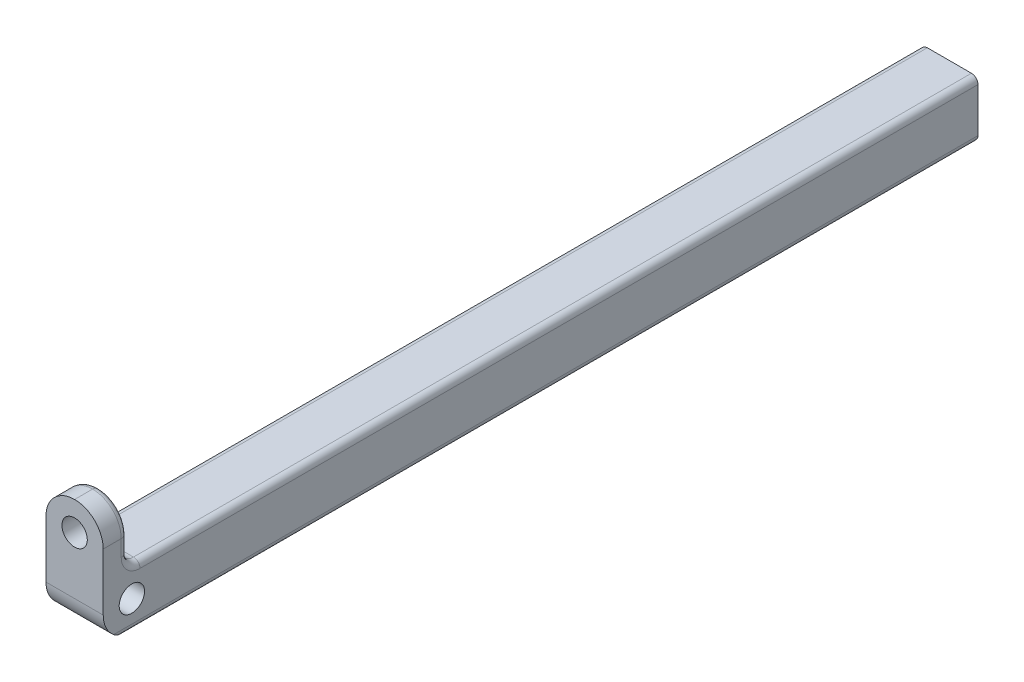
ISO-10303-21;
HEADER;
FILE_DESCRIPTION(('STEP AP214'),'2;1');
FILE_NAME('part.step','',(''),(''),'','','');
FILE_SCHEMA(('AUTOMOTIVE_DESIGN { 1 0 10303 214 1 1 1 1 }'));
ENDSEC;
DATA;
#1=APPLICATION_CONTEXT('core data for automotive mechanical design processes');
#2=APPLICATION_PROTOCOL_DEFINITION('international standard','automotive_design',2000,#1);
#3=PRODUCT_CONTEXT('',#1,'mechanical');
#4=PRODUCT('Part','Part','',(#3));
#5=PRODUCT_RELATED_PRODUCT_CATEGORY('part','',(#4));
#6=PRODUCT_DEFINITION_FORMATION('','',#4);
#7=PRODUCT_DEFINITION_CONTEXT('part definition',#1,'design');
#8=PRODUCT_DEFINITION('design','',#6,#7);
#9=PRODUCT_DEFINITION_SHAPE('','',#8);
#10=(LENGTH_UNIT() NAMED_UNIT(*) SI_UNIT(.MILLI.,.METRE.));
#11=(NAMED_UNIT(*) PLANE_ANGLE_UNIT() SI_UNIT($,.RADIAN.));
#12=(NAMED_UNIT(*) SI_UNIT($,.STERADIAN.) SOLID_ANGLE_UNIT());
#13=UNCERTAINTY_MEASURE_WITH_UNIT(LENGTH_MEASURE(1.E-05),#10,'distance_accuracy_value','');
#14=(GEOMETRIC_REPRESENTATION_CONTEXT(3) GLOBAL_UNCERTAINTY_ASSIGNED_CONTEXT((#13)) GLOBAL_UNIT_ASSIGNED_CONTEXT((#10,
#11,#12)) REPRESENTATION_CONTEXT('',''));
#15=CARTESIAN_POINT('',(0.,0.,0.));
#16=DIRECTION('',(0.,0.,1.));
#17=DIRECTION('',(1.,0.,0.));
#18=AXIS2_PLACEMENT_3D('',#15,#16,#17);
#19=CARTESIAN_POINT('',(-3.5,3.5,107.));
#20=DIRECTION('',(0.,-1.,0.));
#21=DIRECTION('',(0.,0.,-1.));
#22=AXIS2_PLACEMENT_3D('',#19,#20,#21);
#23=PLANE('',#22);
#24=DIRECTION('',(-1.,0.,0.));
#25=VECTOR('',#24,1.);
#26=CARTESIAN_POINT('',(-3.5,3.5,0.));
#27=LINE('',#26,#25);
#28=CARTESIAN_POINT('',(2.7,3.5,0.));
#29=VERTEX_POINT('',#28);
#30=CARTESIAN_POINT('',(-2.7,3.5,0.));
#31=VERTEX_POINT('',#30);
#32=EDGE_CURVE('E182',#29,#31,#27,.T.);
#33=ORIENTED_EDGE('',*,*,#32,.T.);
#34=DIRECTION('',(0.,0.,-1.));
#35=VECTOR('',#34,1.);
#36=CARTESIAN_POINT('',(-2.7,3.5,107.));
#37=LINE('',#36,#35);
#38=CARTESIAN_POINT('',(-2.7,3.5,102.5));
#39=VERTEX_POINT('',#38);
#40=EDGE_CURVE('E222',#31,#39,#37,.F.);
#41=ORIENTED_EDGE('',*,*,#40,.T.);
#42=DIRECTION('',(-1.,0.,0.));
#43=VECTOR('',#42,1.);
#44=CARTESIAN_POINT('',(3.5,3.5,102.5));
#45=LINE('',#44,#43);
#46=CARTESIAN_POINT('',(2.7,3.5,102.5));
#47=VERTEX_POINT('',#46);
#48=EDGE_CURVE('E205',#39,#47,#45,.F.);
#49=ORIENTED_EDGE('',*,*,#48,.T.);
#50=DIRECTION('',(0.,0.,-1.));
#51=VECTOR('',#50,1.);
#52=CARTESIAN_POINT('',(2.7,3.5,107.));
#53=LINE('',#52,#51);
#54=EDGE_CURVE('E220',#47,#29,#53,.T.);
#55=ORIENTED_EDGE('',*,*,#54,.T.);
#56=EDGE_LOOP('',(#33,#41,#49,#55));
#57=FACE_BOUND('',#56,.T.);
#58=ADVANCED_FACE('F37',(#57),#23,.F.);
#59=CARTESIAN_POINT('',(3.5,3.5,107.));
#60=DIRECTION('',(-1.,0.,0.));
#61=DIRECTION('',(0.,-1.,0.));
#62=AXIS2_PLACEMENT_3D('',#59,#60,#61);
#63=PLANE('',#62);
#64=CARTESIAN_POINT('',(3.5,0.,103.5));
#65=DIRECTION('',(1.,0.,0.));
#66=DIRECTION('',(0.,1.,0.));
#67=AXIS2_PLACEMENT_3D('',#64,#65,#66);
#68=CIRCLE('',#67,1.54999999999999);
#69=CARTESIAN_POINT('',(3.5,1.54999999999999,103.5));
#70=VERTEX_POINT('',#69);
#71=EDGE_CURVE('E177',#70,#70,#68,.T.);
#72=ORIENTED_EDGE('',*,*,#71,.F.);
#73=EDGE_LOOP('',(#72));
#74=FACE_BOUND('',#73,.T.);
#75=CARTESIAN_POINT('',(3.5,0.,103.5));
#76=DIRECTION('',(-1.,0.,0.));
#77=DIRECTION('',(0.,-1.,0.));
#78=AXIS2_PLACEMENT_3D('',#75,#76,#77);
#79=CIRCLE('',#78,3.5);
#80=CARTESIAN_POINT('',(3.5,0.,107.));
#81=VERTEX_POINT('',#80);
#82=CARTESIAN_POINT('',(3.5,-2.7,105.727105745132));
#83=VERTEX_POINT('',#82);
#84=EDGE_CURVE('E148',#81,#83,#79,.F.);
#85=ORIENTED_EDGE('',*,*,#84,.T.);
#86=DIRECTION('',(0.,0.,-1.));
#87=VECTOR('',#86,1.);
#88=CARTESIAN_POINT('',(3.5,-2.7,107.));
#89=LINE('',#88,#87);
#90=CARTESIAN_POINT('',(3.5,-2.7,0.));
#91=VERTEX_POINT('',#90);
#92=EDGE_CURVE('E11',#83,#91,#89,.T.);
#93=ORIENTED_EDGE('',*,*,#92,.T.);
#94=DIRECTION('',(0.,1.,0.));
#95=VECTOR('',#94,1.);
#96=CARTESIAN_POINT('',(3.5,3.5,0.));
#97=LINE('',#96,#95);
#98=CARTESIAN_POINT('',(3.5,2.7,0.));
#99=VERTEX_POINT('',#98);
#100=EDGE_CURVE('E180',#91,#99,#97,.T.);
#101=ORIENTED_EDGE('',*,*,#100,.T.);
#102=DIRECTION('',(0.,0.,-1.));
#103=VECTOR('',#102,1.);
#104=CARTESIAN_POINT('',(3.5,2.7,107.));
#105=LINE('',#104,#103);
#106=CARTESIAN_POINT('',(3.5,2.7,102.5));
#107=VERTEX_POINT('',#106);
#108=EDGE_CURVE('E240',#99,#107,#105,.F.);
#109=ORIENTED_EDGE('',*,*,#108,.T.);
#110=CARTESIAN_POINT('',(3.5,5.,102.5));
#111=DIRECTION('',(-1.,0.,0.));
#112=DIRECTION('',(0.,-1.,0.));
#113=AXIS2_PLACEMENT_3D('',#110,#111,#112);
#114=CIRCLE('',#113,2.3);
#115=CARTESIAN_POINT('',(3.5,5.,104.8));
#116=VERTEX_POINT('',#115);
#117=EDGE_CURVE('E242',#107,#116,#114,.T.);
#118=ORIENTED_EDGE('',*,*,#117,.T.);
#119=DIRECTION('',(0.,-1.,0.));
#120=VECTOR('',#119,1.);
#121=CARTESIAN_POINT('',(3.5,3.5,104.8));
#122=LINE('',#121,#120);
#123=CARTESIAN_POINT('',(3.5,7.,104.8));
#124=VERTEX_POINT('',#123);
#125=EDGE_CURVE('E244',#116,#124,#122,.F.);
#126=ORIENTED_EDGE('',*,*,#125,.T.);
#127=DIRECTION('',(0.,0.,-1.));
#128=VECTOR('',#127,1.);
#129=CARTESIAN_POINT('',(3.5,7.,107.));
#130=LINE('',#129,#128);
#131=CARTESIAN_POINT('',(3.5,7.,107.));
#132=VERTEX_POINT('',#131);
#133=EDGE_CURVE('E168',#124,#132,#130,.F.);
#134=ORIENTED_EDGE('',*,*,#133,.T.);
#135=DIRECTION('',(0.,1.,0.));
#136=VECTOR('',#135,1.);
#137=CARTESIAN_POINT('',(3.5,3.5,107.));
#138=LINE('',#137,#136);
#139=EDGE_CURVE('E162',#81,#132,#138,.T.);
#140=ORIENTED_EDGE('',*,*,#139,.F.);
#141=EDGE_LOOP('',(#85,#93,#101,#109,#118,#126,#134,#140));
#142=FACE_BOUND('',#141,.T.);
#143=ADVANCED_FACE('F166',(#74,#142),#63,.F.);
#144=CARTESIAN_POINT('',(-3.5,3.5,107.));
#145=DIRECTION('',(1.,0.,0.));
#146=DIRECTION('',(0.,1.,0.));
#147=AXIS2_PLACEMENT_3D('',#144,#145,#146);
#148=PLANE('',#147);
#149=CARTESIAN_POINT('',(-3.5,0.,103.5));
#150=DIRECTION('',(1.,0.,0.));
#151=DIRECTION('',(0.,1.,0.));
#152=AXIS2_PLACEMENT_3D('',#149,#150,#151);
#153=CIRCLE('',#152,1.54999999999999);
#154=CARTESIAN_POINT('',(-3.5,1.54999999999999,103.5));
#155=VERTEX_POINT('',#154);
#156=EDGE_CURVE('E183',#155,#155,#153,.T.);
#157=ORIENTED_EDGE('',*,*,#156,.T.);
#158=EDGE_LOOP('',(#157));
#159=FACE_BOUND('',#158,.T.);
#160=DIRECTION('',(0.,-1.,0.));
#161=VECTOR('',#160,1.);
#162=CARTESIAN_POINT('',(-3.5,3.5,0.));
#163=LINE('',#162,#161);
#164=CARTESIAN_POINT('',(-3.5,2.7,0.));
#165=VERTEX_POINT('',#164);
#166=CARTESIAN_POINT('',(-3.5,-2.7,0.));
#167=VERTEX_POINT('',#166);
#168=EDGE_CURVE('E174',#165,#167,#163,.T.);
#169=ORIENTED_EDGE('',*,*,#168,.T.);
#170=DIRECTION('',(0.,0.,-1.));
#171=VECTOR('',#170,1.);
#172=CARTESIAN_POINT('',(-3.5,-2.7,107.));
#173=LINE('',#172,#171);
#174=CARTESIAN_POINT('',(-3.5,-2.7,105.727105745132));
#175=VERTEX_POINT('',#174);
#176=EDGE_CURVE('E61',#167,#175,#173,.F.);
#177=ORIENTED_EDGE('',*,*,#176,.T.);
#178=CARTESIAN_POINT('',(-3.5,0.,103.5));
#179=DIRECTION('',(1.,0.,0.));
#180=DIRECTION('',(0.,1.,0.));
#181=AXIS2_PLACEMENT_3D('',#178,#179,#180);
#182=CIRCLE('',#181,3.5);
#183=CARTESIAN_POINT('',(-3.5,0.,107.));
#184=VERTEX_POINT('',#183);
#185=EDGE_CURVE('E189',#175,#184,#182,.F.);
#186=ORIENTED_EDGE('',*,*,#185,.T.);
#187=DIRECTION('',(0.,-1.,0.));
#188=VECTOR('',#187,1.);
#189=CARTESIAN_POINT('',(-3.5,3.5,107.));
#190=LINE('',#189,#188);
#191=CARTESIAN_POINT('',(-3.5,7.,107.));
#192=VERTEX_POINT('',#191);
#193=EDGE_CURVE('E164',#192,#184,#190,.T.);
#194=ORIENTED_EDGE('',*,*,#193,.F.);
#195=DIRECTION('',(0.,0.,1.));
#196=VECTOR('',#195,1.);
#197=CARTESIAN_POINT('',(-3.5,7.,107.));
#198=LINE('',#197,#196);
#199=CARTESIAN_POINT('',(-3.5,7.,104.8));
#200=VERTEX_POINT('',#199);
#201=EDGE_CURVE('E196',#192,#200,#198,.F.);
#202=ORIENTED_EDGE('',*,*,#201,.T.);
#203=DIRECTION('',(0.,-1.,0.));
#204=VECTOR('',#203,1.);
#205=CARTESIAN_POINT('',(-3.5,3.5,104.8));
#206=LINE('',#205,#204);
#207=CARTESIAN_POINT('',(-3.5,5.,104.8));
#208=VERTEX_POINT('',#207);
#209=EDGE_CURVE('E208',#200,#208,#206,.T.);
#210=ORIENTED_EDGE('',*,*,#209,.T.);
#211=CARTESIAN_POINT('',(-3.5,5.,102.5));
#212=DIRECTION('',(1.,0.,0.));
#213=DIRECTION('',(0.,1.,0.));
#214=AXIS2_PLACEMENT_3D('',#211,#212,#213);
#215=CIRCLE('',#214,2.3);
#216=CARTESIAN_POINT('',(-3.5,2.7,102.5));
#217=VERTEX_POINT('',#216);
#218=EDGE_CURVE('E210',#208,#217,#215,.T.);
#219=ORIENTED_EDGE('',*,*,#218,.T.);
#220=DIRECTION('',(0.,0.,-1.));
#221=VECTOR('',#220,1.);
#222=CARTESIAN_POINT('',(-3.5,2.7,107.));
#223=LINE('',#222,#221);
#224=EDGE_CURVE('E212',#217,#165,#223,.T.);
#225=ORIENTED_EDGE('',*,*,#224,.T.);
#226=EDGE_LOOP('',(#169,#177,#186,#194,#202,#210,#219,#225));
#227=FACE_BOUND('',#226,.T.);
#228=ADVANCED_FACE('F354',(#159,#227),#148,.F.);
#229=CARTESIAN_POINT('',(-3.5,-3.5,107.));
#230=DIRECTION('',(0.,1.,0.));
#231=DIRECTION('',(0.,0.,1.));
#232=AXIS2_PLACEMENT_3D('',#229,#230,#231);
#233=PLANE('',#232);
#234=DIRECTION('',(1.,0.,0.));
#235=VECTOR('',#234,1.);
#236=CARTESIAN_POINT('',(-3.5,-3.5,103.5));
#237=LINE('',#236,#235);
#238=CARTESIAN_POINT('',(2.7,-3.5,103.5));
#239=VERTEX_POINT('',#238);
#240=CARTESIAN_POINT('',(-2.7,-3.5,103.5));
#241=VERTEX_POINT('',#240);
#242=EDGE_CURVE('E155',#239,#241,#237,.F.);
#243=ORIENTED_EDGE('',*,*,#242,.T.);
#244=DIRECTION('',(0.,0.,-1.));
#245=VECTOR('',#244,1.);
#246=CARTESIAN_POINT('',(-2.7,-3.5,107.));
#247=LINE('',#246,#245);
#248=CARTESIAN_POINT('',(-2.7,-3.5,0.));
#249=VERTEX_POINT('',#248);
#250=EDGE_CURVE('E270',#241,#249,#247,.T.);
#251=ORIENTED_EDGE('',*,*,#250,.T.);
#252=DIRECTION('',(1.,0.,0.));
#253=VECTOR('',#252,1.);
#254=CARTESIAN_POINT('',(-3.5,-3.5,0.));
#255=LINE('',#254,#253);
#256=CARTESIAN_POINT('',(2.7,-3.5,0.));
#257=VERTEX_POINT('',#256);
#258=EDGE_CURVE('E170',#249,#257,#255,.T.);
#259=ORIENTED_EDGE('',*,*,#258,.T.);
#260=DIRECTION('',(0.,0.,-1.));
#261=VECTOR('',#260,1.);
#262=CARTESIAN_POINT('',(2.7,-3.5,107.));
#263=LINE('',#262,#261);
#264=EDGE_CURVE('E246',#257,#239,#263,.F.);
#265=ORIENTED_EDGE('',*,*,#264,.T.);
#266=EDGE_LOOP('',(#243,#251,#259,#265));
#267=FACE_BOUND('',#266,.T.);
#268=ADVANCED_FACE('F359',(#267),#233,.F.);
#269=CARTESIAN_POINT('',(0.,0.,107.));
#270=DIRECTION('',(0.,0.,1.));
#271=DIRECTION('',(1.,0.,0.));
#272=AXIS2_PLACEMENT_3D('',#269,#270,#271);
#273=PLANE('',#272);
#274=CARTESIAN_POINT('',(0.,7.,107.));
#275=DIRECTION('',(0.,0.,-1.));
#276=DIRECTION('',(-1.,0.,0.));
#277=AXIS2_PLACEMENT_3D('',#274,#275,#276);
#278=CIRCLE('',#277,1.55);
#279=CARTESIAN_POINT('',(-1.55,7.,107.));
#280=VERTEX_POINT('',#279);
#281=EDGE_CURVE('E202',#280,#280,#278,.T.);
#282=ORIENTED_EDGE('',*,*,#281,.T.);
#283=EDGE_LOOP('',(#282));
#284=FACE_BOUND('',#283,.T.);
#285=ORIENTED_EDGE('',*,*,#139,.T.);
#286=CARTESIAN_POINT('',(0.,7.,107.));
#287=DIRECTION('',(0.,0.,1.));
#288=DIRECTION('',(1.,0.,0.));
#289=AXIS2_PLACEMENT_3D('',#286,#287,#288);
#290=CIRCLE('',#289,3.5);
#291=CARTESIAN_POINT('',(0.,10.5,107.));
#292=VERTEX_POINT('',#291);
#293=EDGE_CURVE('E194',#132,#292,#290,.T.);
#294=ORIENTED_EDGE('',*,*,#293,.T.);
#295=CARTESIAN_POINT('',(0.,7.,107.));
#296=DIRECTION('',(0.,0.,1.));
#297=DIRECTION('',(1.,0.,0.));
#298=AXIS2_PLACEMENT_3D('',#295,#296,#297);
#299=CIRCLE('',#298,3.5);
#300=EDGE_CURVE('E192',#292,#192,#299,.T.);
#301=ORIENTED_EDGE('',*,*,#300,.T.);
#302=ORIENTED_EDGE('',*,*,#193,.T.);
#303=DIRECTION('',(1.,0.,0.));
#304=VECTOR('',#303,1.);
#305=CARTESIAN_POINT('',(3.5,0.,107.));
#306=LINE('',#305,#304);
#307=EDGE_CURVE('E151',#184,#81,#306,.T.);
#308=ORIENTED_EDGE('',*,*,#307,.T.);
#309=EDGE_LOOP('',(#285,#294,#301,#302,#308));
#310=FACE_BOUND('',#309,.T.);
#311=ADVANCED_FACE('F160',(#284,#310),#273,.T.);
#312=CARTESIAN_POINT('',(0.,0.,0.));
#313=DIRECTION('',(0.,0.,1.));
#314=DIRECTION('',(1.,0.,0.));
#315=AXIS2_PLACEMENT_3D('',#312,#313,#314);
#316=PLANE('',#315);
#317=ORIENTED_EDGE('',*,*,#258,.F.);
#318=CARTESIAN_POINT('',(-2.7,-2.7,0.));
#319=DIRECTION('',(0.,0.,1.));
#320=DIRECTION('',(1.,0.,0.));
#321=AXIS2_PLACEMENT_3D('',#318,#319,#320);
#322=CIRCLE('',#321,0.8);
#323=EDGE_CURVE('E275',#249,#167,#322,.F.);
#324=ORIENTED_EDGE('',*,*,#323,.T.);
#325=ORIENTED_EDGE('',*,*,#168,.F.);
#326=CARTESIAN_POINT('',(-2.7,2.7,0.));
#327=DIRECTION('',(0.,0.,1.));
#328=DIRECTION('',(1.,0.,0.));
#329=AXIS2_PLACEMENT_3D('',#326,#327,#328);
#330=CIRCLE('',#329,0.8);
#331=EDGE_CURVE('E218',#165,#31,#330,.F.);
#332=ORIENTED_EDGE('',*,*,#331,.T.);
#333=ORIENTED_EDGE('',*,*,#32,.F.);
#334=CARTESIAN_POINT('',(2.7,2.7,0.));
#335=DIRECTION('',(0.,0.,1.));
#336=DIRECTION('',(1.,0.,0.));
#337=AXIS2_PLACEMENT_3D('',#334,#335,#336);
#338=CIRCLE('',#337,0.8);
#339=EDGE_CURVE('E215',#29,#99,#338,.F.);
#340=ORIENTED_EDGE('',*,*,#339,.T.);
#341=ORIENTED_EDGE('',*,*,#100,.F.);
#342=CARTESIAN_POINT('',(2.7,-2.7,0.));
#343=DIRECTION('',(0.,0.,1.));
#344=DIRECTION('',(1.,0.,0.));
#345=AXIS2_PLACEMENT_3D('',#342,#343,#344);
#346=CIRCLE('',#345,0.8);
#347=EDGE_CURVE('E273',#91,#257,#346,.F.);
#348=ORIENTED_EDGE('',*,*,#347,.T.);
#349=EDGE_LOOP('',(#317,#324,#325,#332,#333,#340,#341,#348));
#350=FACE_BOUND('',#349,.T.);
#351=ADVANCED_FACE('F290',(#350),#316,.F.);
#352=CARTESIAN_POINT('',(0.,0.,103.5));
#353=DIRECTION('',(-1.,0.,0.));
#354=DIRECTION('',(0.,0.,1.));
#355=AXIS2_PLACEMENT_3D('',#352,#353,#354);
#356=CYLINDRICAL_SURFACE('',#355,3.5);
#357=ORIENTED_EDGE('',*,*,#185,.F.);
#358=CARTESIAN_POINT('',(-3.5,-2.7,105.727105745132));
#359=CARTESIAN_POINT('',(-3.49997790634017,-2.73578077826927,105.683740012094));
#360=CARTESIAN_POINT('',(-3.49760204742852,-2.77046771405746,105.639546970417));
#361=CARTESIAN_POINT('',(-3.48883215337653,-2.83744212990076,105.549885837599));
#362=CARTESIAN_POINT('',(-3.48244581441398,-2.86973407357622,105.504420347611));
#363=CARTESIAN_POINT('',(-3.46639989402995,-2.9316099904447,105.412773436482));
#364=CARTESIAN_POINT('',(-3.45676542280018,-2.96121258994889,105.366600026079));
#365=CARTESIAN_POINT('',(-3.43472922580525,-3.01796243965984,105.273381562708));
#366=CARTESIAN_POINT('',(-3.42232567892856,-3.04510805741891,105.226335954888));
#367=CARTESIAN_POINT('',(-3.38721924491046,-3.1121771529453,105.103656190191));
#368=CARTESIAN_POINT('',(-3.36275094354892,-3.15021900189438,105.027491078594));
#369=CARTESIAN_POINT('',(-3.30939609632481,-3.22016334972214,104.873927316086));
#370=CARTESIAN_POINT('',(-3.28050786925723,-3.25206350201542,104.796528205876));
#371=CARTESIAN_POINT('',(-3.18861879254974,-3.3390615021577,104.56230135668));
#372=CARTESIAN_POINT('',(-3.12057510030014,-3.38514640407985,104.404021503058));
#373=CARTESIAN_POINT('',(-2.99437521495339,-3.4463534981345,104.123081332067));
#374=CARTESIAN_POINT('',(-2.93762159241726,-3.466193436758,104.000736087576));
#375=CARTESIAN_POINT('',(-2.82227073924932,-3.4928054574686,103.755791889969));
#376=CARTESIAN_POINT('',(-2.76367847793431,-3.49961011925023,103.633194338056));
#377=CARTESIAN_POINT('',(-2.70340235184538,-3.4999945715011,103.507116536324));
#378=CARTESIAN_POINT('',(-2.70170115627901,-3.49999999744037,103.50355823084));
#379=CARTESIAN_POINT('',(-2.7,-3.5,103.5));
#380=B_SPLINE_CURVE_WITH_KNOTS('',3,(#358,#359,#360,#361,#362,#363,#364,#365,#366,#367,#368,
#369,#370,#371,#372,#373,#374,#375,#376,#377,#378,#379),.UNSPECIFIED.,.F.,.F.,(4,2,2,2,2,2,2,2,
2,2,4),(0.,0.168516062198225,0.336709723374923,0.503631866603884,0.670664113019234,
0.935994806454121,1.20142667565851,1.73430812786229,2.14272752893249,2.55012480907741,
2.56195697984311),.UNSPECIFIED.);
#381=EDGE_CURVE('E46',#175,#241,#380,.T.);
#382=ORIENTED_EDGE('',*,*,#381,.T.);
#383=ORIENTED_EDGE('',*,*,#242,.F.);
#384=CARTESIAN_POINT('',(3.5,-2.7,105.727105745132));
#385=CARTESIAN_POINT('',(3.49997790634017,-2.73578077826927,105.683740012094));
#386=CARTESIAN_POINT('',(3.49760204742852,-2.77046771405747,105.639546970416));
#387=CARTESIAN_POINT('',(3.48883215337653,-2.83744212990077,105.549885837599));
#388=CARTESIAN_POINT('',(3.48244581441398,-2.86973407357623,105.504420347611));
#389=CARTESIAN_POINT('',(3.46639989402994,-2.93160999044472,105.412773436482));
#390=CARTESIAN_POINT('',(3.45676542280018,-2.9612125899489,105.366600026079));
#391=CARTESIAN_POINT('',(3.43472922580525,-3.01796243965984,105.273381562708));
#392=CARTESIAN_POINT('',(3.42232567892856,-3.04510805741891,105.226335954888));
#393=CARTESIAN_POINT('',(3.38721924491046,-3.1121771529453,105.103656190191));
#394=CARTESIAN_POINT('',(3.36275094354893,-3.15021900189437,105.027491078594));
#395=CARTESIAN_POINT('',(3.30939609632482,-3.22016334972213,104.873927316086));
#396=CARTESIAN_POINT('',(3.28050786925723,-3.25206350201541,104.796528205876));
#397=CARTESIAN_POINT('',(3.18861879254976,-3.3390615021577,104.56230135668));
#398=CARTESIAN_POINT('',(3.12057510030023,-3.38514640407985,104.404021503058));
#399=CARTESIAN_POINT('',(2.99437521495333,-3.4463534981345,104.123081332067));
#400=CARTESIAN_POINT('',(2.93762159241704,-3.466193436758,104.000736087576));
#401=CARTESIAN_POINT('',(2.82227073924954,-3.4928054574686,103.755791889969));
#402=CARTESIAN_POINT('',(2.76367847793513,-3.49961011925023,103.633194338056));
#403=CARTESIAN_POINT('',(2.70340235184543,-3.4999945715011,103.507116536324));
#404=CARTESIAN_POINT('',(2.70170115627903,-3.49999999744037,103.50355823084));
#405=CARTESIAN_POINT('',(2.7,-3.5,103.5));
#406=B_SPLINE_CURVE_WITH_KNOTS('',3,(#384,#385,#386,#387,#388,#389,#390,#391,#392,#393,#394,
#395,#396,#397,#398,#399,#400,#401,#402,#403,#404,#405),.UNSPECIFIED.,.F.,.F.,(4,2,2,2,2,2,2,2,
2,2,4),(0.,0.168516062198242,0.336709723374957,0.5036318666039,0.670664113019234,
0.935994806454103,1.20142667565847,1.73430812786229,2.14272752893249,2.55012480907741,
2.56195697984311),.UNSPECIFIED.);
#407=EDGE_CURVE('E53',#239,#83,#406,.F.);
#408=ORIENTED_EDGE('',*,*,#407,.T.);
#409=ORIENTED_EDGE('',*,*,#84,.F.);
#410=ORIENTED_EDGE('',*,*,#307,.F.);
#411=EDGE_LOOP('',(#357,#382,#383,#408,#409,#410));
#412=FACE_BOUND('',#411,.T.);
#413=ADVANCED_FACE('F150',(#412),#356,.T.);
#414=CARTESIAN_POINT('',(-3.5,0.,103.5));
#415=DIRECTION('',(1.,0.,0.));
#416=DIRECTION('',(0.,1.,0.));
#417=AXIS2_PLACEMENT_3D('',#414,#415,#416);
#418=CYLINDRICAL_SURFACE('',#417,1.54999999999999);
#419=ORIENTED_EDGE('',*,*,#156,.F.);
#420=EDGE_LOOP('',(#419));
#421=FACE_BOUND('',#420,.T.);
#422=ORIENTED_EDGE('',*,*,#71,.T.);
#423=EDGE_LOOP('',(#422));
#424=FACE_BOUND('',#423,.T.);
#425=ADVANCED_FACE('F289',(#421,#424),#418,.F.);
#426=CARTESIAN_POINT('',(-3.5,10.5,104.));
#427=DIRECTION('',(0.,0.,1.));
#428=DIRECTION('',(1.,0.,0.));
#429=AXIS2_PLACEMENT_3D('',#426,#427,#428);
#430=PLANE('',#429);
#431=CARTESIAN_POINT('',(0.,7.,104.));
#432=DIRECTION('',(0.,0.,-1.));
#433=DIRECTION('',(-1.,0.,0.));
#434=AXIS2_PLACEMENT_3D('',#431,#432,#433);
#435=CIRCLE('',#434,1.55);
#436=CARTESIAN_POINT('',(-1.55,7.,104.));
#437=VERTEX_POINT('',#436);
#438=EDGE_CURVE('E268',#437,#437,#435,.T.);
#439=ORIENTED_EDGE('',*,*,#438,.F.);
#440=EDGE_LOOP('',(#439));
#441=FACE_BOUND('',#440,.T.);
#442=DIRECTION('',(-1.,0.,0.));
#443=VECTOR('',#442,1.);
#444=CARTESIAN_POINT('',(-3.5,5.,104.));
#445=LINE('',#444,#443);
#446=CARTESIAN_POINT('',(2.7,5.,104.));
#447=VERTEX_POINT('',#446);
#448=CARTESIAN_POINT('',(-2.7,5.,104.));
#449=VERTEX_POINT('',#448);
#450=EDGE_CURVE('E199',#447,#449,#445,.T.);
#451=ORIENTED_EDGE('',*,*,#450,.T.);
#452=DIRECTION('',(0.,-1.,0.));
#453=VECTOR('',#452,1.);
#454=CARTESIAN_POINT('',(-2.7,10.5,104.));
#455=LINE('',#454,#453);
#456=CARTESIAN_POINT('',(-2.7,7.,104.));
#457=VERTEX_POINT('',#456);
#458=EDGE_CURVE('E234',#449,#457,#455,.F.);
#459=ORIENTED_EDGE('',*,*,#458,.T.);
#460=CARTESIAN_POINT('',(0.,7.,104.));
#461=DIRECTION('',(0.,0.,1.));
#462=DIRECTION('',(1.,0.,0.));
#463=AXIS2_PLACEMENT_3D('',#460,#461,#462);
#464=CIRCLE('',#463,2.7);
#465=CARTESIAN_POINT('',(0.,9.7,104.));
#466=VERTEX_POINT('',#465);
#467=EDGE_CURVE('E232',#457,#466,#464,.F.);
#468=ORIENTED_EDGE('',*,*,#467,.T.);
#469=CARTESIAN_POINT('',(0.,7.,104.));
#470=DIRECTION('',(0.,0.,1.));
#471=DIRECTION('',(1.,0.,0.));
#472=AXIS2_PLACEMENT_3D('',#469,#470,#471);
#473=CIRCLE('',#472,2.7);
#474=CARTESIAN_POINT('',(2.7,7.,104.));
#475=VERTEX_POINT('',#474);
#476=EDGE_CURVE('E230',#466,#475,#473,.F.);
#477=ORIENTED_EDGE('',*,*,#476,.T.);
#478=DIRECTION('',(0.,-1.,0.));
#479=VECTOR('',#478,1.);
#480=CARTESIAN_POINT('',(2.7,10.5,104.));
#481=LINE('',#480,#479);
#482=EDGE_CURVE('E228',#475,#447,#481,.T.);
#483=ORIENTED_EDGE('',*,*,#482,.T.);
#484=EDGE_LOOP('',(#451,#459,#468,#477,#483));
#485=FACE_BOUND('',#484,.T.);
#486=ADVANCED_FACE('F301',(#441,#485),#430,.F.);
#487=CARTESIAN_POINT('',(0.,7.,0.));
#488=DIRECTION('',(0.,0.,1.));
#489=DIRECTION('',(1.,0.,0.));
#490=AXIS2_PLACEMENT_3D('',#487,#488,#489);
#491=CYLINDRICAL_SURFACE('',#490,3.5);
#492=DIRECTION('',(0.,0.,1.));
#493=VECTOR('',#492,1.);
#494=CARTESIAN_POINT('',(0.,10.5,0.));
#495=LINE('',#494,#493);
#496=CARTESIAN_POINT('',(0.,10.5,104.8));
#497=VERTEX_POINT('',#496);
#498=EDGE_CURVE('E200',#497,#292,#495,.T.);
#499=ORIENTED_EDGE('',*,*,#498,.F.);
#500=CARTESIAN_POINT('',(0.,7.,104.8));
#501=DIRECTION('',(0.,0.,1.));
#502=DIRECTION('',(1.,0.,0.));
#503=AXIS2_PLACEMENT_3D('',#500,#501,#502);
#504=CIRCLE('',#503,3.5);
#505=EDGE_CURVE('E236',#497,#200,#504,.T.);
#506=ORIENTED_EDGE('',*,*,#505,.T.);
#507=ORIENTED_EDGE('',*,*,#201,.F.);
#508=ORIENTED_EDGE('',*,*,#300,.F.);
#509=EDGE_LOOP('',(#499,#506,#507,#508));
#510=FACE_BOUND('',#509,.T.);
#511=ADVANCED_FACE('F297',(#510),#491,.T.);
#512=CARTESIAN_POINT('',(0.,7.,0.));
#513=DIRECTION('',(0.,0.,-1.));
#514=DIRECTION('',(-1.,0.,0.));
#515=AXIS2_PLACEMENT_3D('',#512,#513,#514);
#516=CYLINDRICAL_SURFACE('',#515,3.5);
#517=ORIENTED_EDGE('',*,*,#133,.F.);
#518=CARTESIAN_POINT('',(0.,7.,104.8));
#519=DIRECTION('',(0.,0.,1.));
#520=DIRECTION('',(1.,0.,0.));
#521=AXIS2_PLACEMENT_3D('',#518,#519,#520);
#522=CIRCLE('',#521,3.5);
#523=EDGE_CURVE('E238',#124,#497,#522,.T.);
#524=ORIENTED_EDGE('',*,*,#523,.T.);
#525=ORIENTED_EDGE('',*,*,#498,.T.);
#526=ORIENTED_EDGE('',*,*,#293,.F.);
#527=EDGE_LOOP('',(#517,#524,#525,#526));
#528=FACE_BOUND('',#527,.T.);
#529=ADVANCED_FACE('F292',(#528),#516,.T.);
#530=CARTESIAN_POINT('',(0.,7.,107.));
#531=DIRECTION('',(0.,0.,-1.));
#532=DIRECTION('',(-1.,0.,0.));
#533=AXIS2_PLACEMENT_3D('',#530,#531,#532);
#534=CYLINDRICAL_SURFACE('',#533,1.55);
#535=ORIENTED_EDGE('',*,*,#281,.F.);
#536=EDGE_LOOP('',(#535));
#537=FACE_BOUND('',#536,.T.);
#538=ORIENTED_EDGE('',*,*,#438,.T.);
#539=EDGE_LOOP('',(#538));
#540=FACE_BOUND('',#539,.T.);
#541=ADVANCED_FACE('F296',(#537,#540),#534,.F.);
#542=CARTESIAN_POINT('',(-3.5,5.,102.5));
#543=DIRECTION('',(1.,0.,0.));
#544=DIRECTION('',(0.,0.,-1.));
#545=AXIS2_PLACEMENT_3D('',#542,#543,#544);
#546=CYLINDRICAL_SURFACE('',#545,1.5);
#547=ORIENTED_EDGE('',*,*,#48,.F.);
#548=CARTESIAN_POINT('',(-2.7,5.,102.5));
#549=DIRECTION('',(1.,0.,0.));
#550=DIRECTION('',(0.,1.,0.));
#551=AXIS2_PLACEMENT_3D('',#548,#549,#550);
#552=CIRCLE('',#551,1.5);
#553=EDGE_CURVE('E226',#39,#449,#552,.F.);
#554=ORIENTED_EDGE('',*,*,#553,.T.);
#555=ORIENTED_EDGE('',*,*,#450,.F.);
#556=CARTESIAN_POINT('',(2.7,5.,102.5));
#557=DIRECTION('',(-1.,0.,0.));
#558=DIRECTION('',(0.,-1.,0.));
#559=AXIS2_PLACEMENT_3D('',#556,#557,#558);
#560=CIRCLE('',#559,1.5);
#561=EDGE_CURVE('E224',#447,#47,#560,.F.);
#562=ORIENTED_EDGE('',*,*,#561,.T.);
#563=EDGE_LOOP('',(#547,#554,#555,#562));
#564=FACE_BOUND('',#563,.T.);
#565=ADVANCED_FACE('F303',(#564),#546,.F.);
#566=CARTESIAN_POINT('',(2.7,2.7,107.));
#567=DIRECTION('',(0.,0.,-1.));
#568=DIRECTION('',(-1.,0.,0.));
#569=AXIS2_PLACEMENT_3D('',#566,#567,#568);
#570=CYLINDRICAL_SURFACE('',#569,0.8);
#571=ORIENTED_EDGE('',*,*,#339,.F.);
#572=ORIENTED_EDGE('',*,*,#54,.F.);
#573=CARTESIAN_POINT('',(2.7,2.7,102.5));
#574=DIRECTION('',(0.,0.,1.));
#575=DIRECTION('',(1.,0.,0.));
#576=AXIS2_PLACEMENT_3D('',#573,#574,#575);
#577=CIRCLE('',#576,0.8);
#578=EDGE_CURVE('E265',#107,#47,#577,.T.);
#579=ORIENTED_EDGE('',*,*,#578,.F.);
#580=ORIENTED_EDGE('',*,*,#108,.F.);
#581=EDGE_LOOP('',(#571,#572,#579,#580));
#582=FACE_BOUND('',#581,.T.);
#583=ADVANCED_FACE('F306',(#582),#570,.T.);
#584=CARTESIAN_POINT('',(2.7,5.,102.5));
#585=DIRECTION('',(-1.,0.,0.));
#586=DIRECTION('',(0.,-1.,0.));
#587=AXIS2_PLACEMENT_3D('',#584,#585,#586);
#588=TOROIDAL_SURFACE('',#587,2.3,0.8);
#589=ORIENTED_EDGE('',*,*,#578,.T.);
#590=ORIENTED_EDGE('',*,*,#561,.F.);
#591=CARTESIAN_POINT('',(2.7,5.,104.8));
#592=DIRECTION('',(0.,1.,0.));
#593=DIRECTION('',(0.,0.,1.));
#594=AXIS2_PLACEMENT_3D('',#591,#592,#593);
#595=CIRCLE('',#594,0.8);
#596=EDGE_CURVE('E262',#116,#447,#595,.T.);
#597=ORIENTED_EDGE('',*,*,#596,.F.);
#598=ORIENTED_EDGE('',*,*,#117,.F.);
#599=EDGE_LOOP('',(#589,#590,#597,#598));
#600=FACE_BOUND('',#599,.T.);
#601=ADVANCED_FACE('F332',(#600),#588,.T.);
#602=CARTESIAN_POINT('',(2.7,10.5,104.8));
#603=DIRECTION('',(0.,-1.,0.));
#604=DIRECTION('',(1.,0.,0.));
#605=AXIS2_PLACEMENT_3D('',#602,#603,#604);
#606=CYLINDRICAL_SURFACE('',#605,0.8);
#607=ORIENTED_EDGE('',*,*,#596,.T.);
#608=ORIENTED_EDGE('',*,*,#482,.F.);
#609=CARTESIAN_POINT('',(2.7,7.,104.8));
#610=DIRECTION('',(0.,1.,0.));
#611=DIRECTION('',(0.,0.,1.));
#612=AXIS2_PLACEMENT_3D('',#609,#610,#611);
#613=CIRCLE('',#612,0.8);
#614=EDGE_CURVE('E259',#124,#475,#613,.T.);
#615=ORIENTED_EDGE('',*,*,#614,.F.);
#616=ORIENTED_EDGE('',*,*,#125,.F.);
#617=EDGE_LOOP('',(#607,#608,#615,#616));
#618=FACE_BOUND('',#617,.T.);
#619=ADVANCED_FACE('F328',(#618),#606,.T.);
#620=CARTESIAN_POINT('',(0.,7.,104.8));
#621=DIRECTION('',(0.,0.,1.));
#622=DIRECTION('',(1.,0.,0.));
#623=AXIS2_PLACEMENT_3D('',#620,#621,#622);
#624=TOROIDAL_SURFACE('',#623,2.7,0.8);
#625=ORIENTED_EDGE('',*,*,#614,.T.);
#626=ORIENTED_EDGE('',*,*,#476,.F.);
#627=CARTESIAN_POINT('',(0.,9.7,104.8));
#628=DIRECTION('',(-1.,0.,0.));
#629=DIRECTION('',(0.,0.,1.));
#630=AXIS2_PLACEMENT_3D('',#627,#628,#629);
#631=CIRCLE('',#630,0.8);
#632=EDGE_CURVE('E256',#497,#466,#631,.T.);
#633=ORIENTED_EDGE('',*,*,#632,.F.);
#634=ORIENTED_EDGE('',*,*,#523,.F.);
#635=EDGE_LOOP('',(#625,#626,#633,#634));
#636=FACE_BOUND('',#635,.T.);
#637=ADVANCED_FACE('F324',(#636),#624,.T.);
#638=CARTESIAN_POINT('',(0.,7.,104.8));
#639=DIRECTION('',(0.,0.,1.));
#640=DIRECTION('',(1.,0.,0.));
#641=AXIS2_PLACEMENT_3D('',#638,#639,#640);
#642=TOROIDAL_SURFACE('',#641,2.7,0.8);
#643=ORIENTED_EDGE('',*,*,#632,.T.);
#644=ORIENTED_EDGE('',*,*,#467,.F.);
#645=CARTESIAN_POINT('',(-2.7,7.,104.8));
#646=DIRECTION('',(0.,-1.,0.));
#647=DIRECTION('',(0.,0.,-1.));
#648=AXIS2_PLACEMENT_3D('',#645,#646,#647);
#649=CIRCLE('',#648,0.8);
#650=EDGE_CURVE('E253',#200,#457,#649,.T.);
#651=ORIENTED_EDGE('',*,*,#650,.F.);
#652=ORIENTED_EDGE('',*,*,#505,.F.);
#653=EDGE_LOOP('',(#643,#644,#651,#652));
#654=FACE_BOUND('',#653,.T.);
#655=ADVANCED_FACE('F320',(#654),#642,.T.);
#656=CARTESIAN_POINT('',(-2.7,3.5,104.8));
#657=DIRECTION('',(0.,-1.,0.));
#658=DIRECTION('',(1.,0.,0.));
#659=AXIS2_PLACEMENT_3D('',#656,#657,#658);
#660=CYLINDRICAL_SURFACE('',#659,0.8);
#661=ORIENTED_EDGE('',*,*,#650,.T.);
#662=ORIENTED_EDGE('',*,*,#458,.F.);
#663=CARTESIAN_POINT('',(-2.7,5.,104.8));
#664=DIRECTION('',(0.,-1.,0.));
#665=DIRECTION('',(0.,0.,-1.));
#666=AXIS2_PLACEMENT_3D('',#663,#664,#665);
#667=CIRCLE('',#666,0.8);
#668=EDGE_CURVE('E250',#208,#449,#667,.T.);
#669=ORIENTED_EDGE('',*,*,#668,.F.);
#670=ORIENTED_EDGE('',*,*,#209,.F.);
#671=EDGE_LOOP('',(#661,#662,#669,#670));
#672=FACE_BOUND('',#671,.T.);
#673=ADVANCED_FACE('F316',(#672),#660,.T.);
#674=CARTESIAN_POINT('',(-2.7,5.,102.5));
#675=DIRECTION('',(1.,0.,0.));
#676=DIRECTION('',(0.,1.,0.));
#677=AXIS2_PLACEMENT_3D('',#674,#675,#676);
#678=TOROIDAL_SURFACE('',#677,2.3,0.8);
#679=ORIENTED_EDGE('',*,*,#668,.T.);
#680=ORIENTED_EDGE('',*,*,#553,.F.);
#681=CARTESIAN_POINT('',(-2.7,2.7,102.5));
#682=DIRECTION('',(0.,0.,-1.));
#683=DIRECTION('',(-1.,0.,0.));
#684=AXIS2_PLACEMENT_3D('',#681,#682,#683);
#685=CIRCLE('',#684,0.8);
#686=EDGE_CURVE('E247',#217,#39,#685,.T.);
#687=ORIENTED_EDGE('',*,*,#686,.F.);
#688=ORIENTED_EDGE('',*,*,#218,.F.);
#689=EDGE_LOOP('',(#679,#680,#687,#688));
#690=FACE_BOUND('',#689,.T.);
#691=ADVANCED_FACE('F312',(#690),#678,.T.);
#692=CARTESIAN_POINT('',(-2.7,2.7,107.));
#693=DIRECTION('',(0.,0.,-1.));
#694=DIRECTION('',(-1.,0.,0.));
#695=AXIS2_PLACEMENT_3D('',#692,#693,#694);
#696=CYLINDRICAL_SURFACE('',#695,0.8);
#697=ORIENTED_EDGE('',*,*,#686,.T.);
#698=ORIENTED_EDGE('',*,*,#40,.F.);
#699=ORIENTED_EDGE('',*,*,#331,.F.);
#700=ORIENTED_EDGE('',*,*,#224,.F.);
#701=EDGE_LOOP('',(#697,#698,#699,#700));
#702=FACE_BOUND('',#701,.T.);
#703=ADVANCED_FACE('F308',(#702),#696,.T.);
#704=CARTESIAN_POINT('',(-2.7,-2.7,107.));
#705=DIRECTION('',(0.,0.,-1.));
#706=DIRECTION('',(-1.,0.,0.));
#707=AXIS2_PLACEMENT_3D('',#704,#705,#706);
#708=CYLINDRICAL_SURFACE('',#707,0.8);
#709=ORIENTED_EDGE('',*,*,#381,.F.);
#710=ORIENTED_EDGE('',*,*,#176,.F.);
#711=ORIENTED_EDGE('',*,*,#323,.F.);
#712=ORIENTED_EDGE('',*,*,#250,.F.);
#713=EDGE_LOOP('',(#709,#710,#711,#712));
#714=FACE_BOUND('',#713,.T.);
#715=ADVANCED_FACE('F311',(#714),#708,.T.);
#716=CARTESIAN_POINT('',(2.7,-2.7,107.));
#717=DIRECTION('',(0.,0.,-1.));
#718=DIRECTION('',(-1.,0.,0.));
#719=AXIS2_PLACEMENT_3D('',#716,#717,#718);
#720=CYLINDRICAL_SURFACE('',#719,0.8);
#721=ORIENTED_EDGE('',*,*,#407,.F.);
#722=ORIENTED_EDGE('',*,*,#264,.F.);
#723=ORIENTED_EDGE('',*,*,#347,.F.);
#724=ORIENTED_EDGE('',*,*,#92,.F.);
#725=EDGE_LOOP('',(#721,#722,#723,#724));
#726=FACE_BOUND('',#725,.T.);
#727=ADVANCED_FACE('F39',(#726),#720,.T.);
#728=CLOSED_SHELL('',(#58,#143,#228,#268,#311,#351,#413,#425,#486,#511,#529,#541,#565,#583,#601,
#619,#637,#655,#673,#691,#703,#715,#727));
#729=MANIFOLD_SOLID_BREP('B2',#728);
#730=ADVANCED_BREP_SHAPE_REPRESENTATION('',(#18,#729),#14);
#731=SHAPE_DEFINITION_REPRESENTATION(#9,#730);
ENDSEC;
END-ISO-10303-21;
